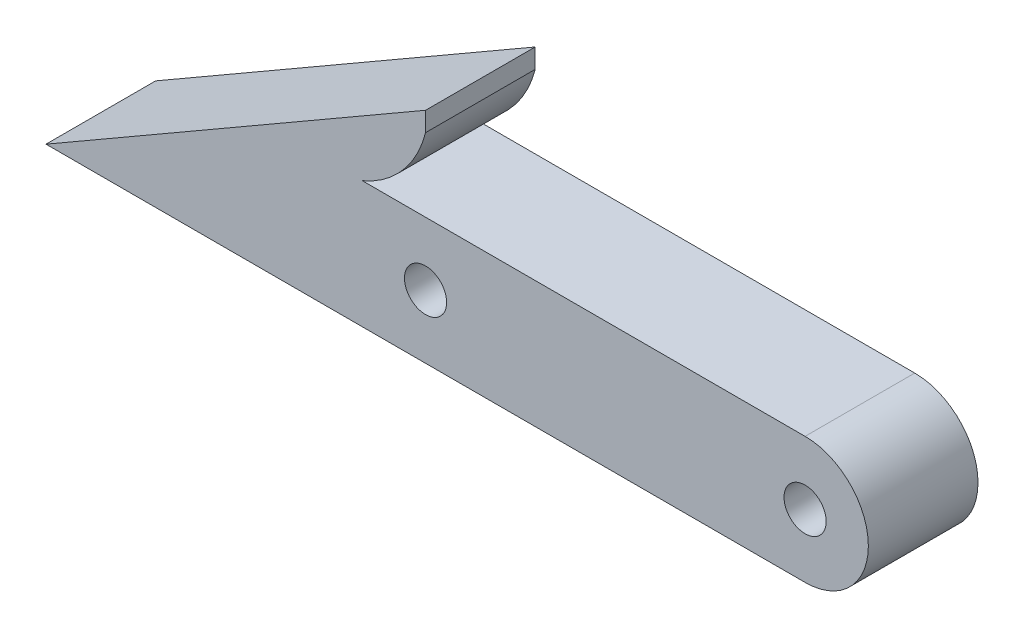
ISO-10303-21;
HEADER;
FILE_DESCRIPTION(('STEP AP214'),'2;1');
FILE_NAME('part.step','',(''),(''),'','','');
FILE_SCHEMA(('AUTOMOTIVE_DESIGN { 1 0 10303 214 1 1 1 1 }'));
ENDSEC;
DATA;
#1=APPLICATION_CONTEXT('core data for automotive mechanical design processes');
#2=APPLICATION_PROTOCOL_DEFINITION('international standard','automotive_design',2000,#1);
#3=PRODUCT_CONTEXT('',#1,'mechanical');
#4=PRODUCT('Part','Part','',(#3));
#5=PRODUCT_RELATED_PRODUCT_CATEGORY('part','',(#4));
#6=PRODUCT_DEFINITION_FORMATION('','',#4);
#7=PRODUCT_DEFINITION_CONTEXT('part definition',#1,'design');
#8=PRODUCT_DEFINITION('design','',#6,#7);
#9=PRODUCT_DEFINITION_SHAPE('','',#8);
#10=(LENGTH_UNIT() NAMED_UNIT(*) SI_UNIT(.MILLI.,.METRE.));
#11=(NAMED_UNIT(*) PLANE_ANGLE_UNIT() SI_UNIT($,.RADIAN.));
#12=(NAMED_UNIT(*) SI_UNIT($,.STERADIAN.) SOLID_ANGLE_UNIT());
#13=UNCERTAINTY_MEASURE_WITH_UNIT(LENGTH_MEASURE(1.E-05),#10,'distance_accuracy_value','');
#14=(GEOMETRIC_REPRESENTATION_CONTEXT(3) GLOBAL_UNCERTAINTY_ASSIGNED_CONTEXT((#13)) GLOBAL_UNIT_ASSIGNED_CONTEXT((#10,
#11,#12)) REPRESENTATION_CONTEXT('',''));
#15=CARTESIAN_POINT('',(0.,0.,0.));
#16=DIRECTION('',(0.,0.,1.));
#17=DIRECTION('',(1.,0.,0.));
#18=AXIS2_PLACEMENT_3D('',#15,#16,#17);
#19=CARTESIAN_POINT('',(0.,7.5,6.5));
#20=DIRECTION('',(0.,-1.,0.));
#21=DIRECTION('',(1.,0.,0.));
#22=AXIS2_PLACEMENT_3D('',#19,#20,#21);
#23=PLANE('',#22);
#24=DIRECTION('',(-1.,0.,0.));
#25=VECTOR('',#24,1.);
#26=CARTESIAN_POINT('',(0.,7.5,-6.5));
#27=LINE('',#26,#25);
#28=CARTESIAN_POINT('',(22.5,7.49999999999999,-6.5));
#29=VERTEX_POINT('',#28);
#30=CARTESIAN_POINT('',(-30.,7.5,-6.5));
#31=VERTEX_POINT('',#30);
#32=EDGE_CURVE('E138',#29,#31,#27,.T.);
#33=ORIENTED_EDGE('',*,*,#32,.T.);
#34=DIRECTION('',(0.,0.,-1.));
#35=VECTOR('',#34,1.);
#36=CARTESIAN_POINT('',(-30.,7.5,6.5));
#37=LINE('',#36,#35);
#38=CARTESIAN_POINT('',(-30.,7.5,6.5));
#39=VERTEX_POINT('',#38);
#40=EDGE_CURVE('E11',#39,#31,#37,.T.);
#41=ORIENTED_EDGE('',*,*,#40,.F.);
#42=DIRECTION('',(-1.,0.,0.));
#43=VECTOR('',#42,1.);
#44=CARTESIAN_POINT('',(0.,7.5,6.5));
#45=LINE('',#44,#43);
#46=CARTESIAN_POINT('',(22.5,7.49999999999999,6.5));
#47=VERTEX_POINT('',#46);
#48=EDGE_CURVE('E91',#47,#39,#45,.T.);
#49=ORIENTED_EDGE('',*,*,#48,.F.);
#50=DIRECTION('',(0.,0.,-1.));
#51=VECTOR('',#50,1.);
#52=CARTESIAN_POINT('',(22.5,7.49999999999999,6.5));
#53=LINE('',#52,#51);
#54=EDGE_CURVE('E126',#47,#29,#53,.T.);
#55=ORIENTED_EDGE('',*,*,#54,.T.);
#56=EDGE_LOOP('',(#33,#41,#49,#55));
#57=FACE_BOUND('',#56,.T.);
#58=ADVANCED_FACE('F43',(#57),#23,.F.);
#59=CARTESIAN_POINT('',(-34.9272257432807,19.3373257055721,6.5));
#60=DIRECTION('',(0.,0.,-1.));
#61=DIRECTION('',(-1.,0.,0.));
#62=AXIS2_PLACEMENT_3D('',#59,#60,#61);
#63=CYLINDRICAL_SURFACE('',#62,12.8218498425557);
#64=CARTESIAN_POINT('',(-34.9272257432807,19.3373257055721,-6.5));
#65=DIRECTION('',(0.,0.,1.));
#66=DIRECTION('',(1.,0.,0.));
#67=AXIS2_PLACEMENT_3D('',#64,#65,#66);
#68=CIRCLE('',#67,12.8218498425557);
#69=CARTESIAN_POINT('',(-22.5,16.1807621135328,-6.5));
#70=VERTEX_POINT('',#69);
#71=EDGE_CURVE('E142',#70,#31,#68,.F.);
#72=ORIENTED_EDGE('',*,*,#71,.F.);
#73=DIRECTION('',(0.,0.,-1.));
#74=VECTOR('',#73,1.);
#75=CARTESIAN_POINT('',(-22.5,16.1807621135328,6.5));
#76=LINE('',#75,#74);
#77=CARTESIAN_POINT('',(-22.5,16.1807621135328,6.5));
#78=VERTEX_POINT('',#77);
#79=EDGE_CURVE('E53',#78,#70,#76,.T.);
#80=ORIENTED_EDGE('',*,*,#79,.F.);
#81=CARTESIAN_POINT('',(-34.9272257432807,19.3373257055721,6.5));
#82=DIRECTION('',(0.,0.,1.));
#83=DIRECTION('',(1.,0.,0.));
#84=AXIS2_PLACEMENT_3D('',#81,#82,#83);
#85=CIRCLE('',#84,12.8218498425557);
#86=EDGE_CURVE('E174',#78,#39,#85,.F.);
#87=ORIENTED_EDGE('',*,*,#86,.T.);
#88=ORIENTED_EDGE('',*,*,#40,.T.);
#89=EDGE_LOOP('',(#72,#80,#87,#88));
#90=FACE_BOUND('',#89,.T.);
#91=ADVANCED_FACE('F173',(#90),#63,.T.);
#92=CARTESIAN_POINT('',(-22.5,0.,6.5));
#93=DIRECTION('',(-1.,0.,0.));
#94=DIRECTION('',(0.,-1.,0.));
#95=AXIS2_PLACEMENT_3D('',#92,#93,#94);
#96=PLANE('',#95);
#97=DIRECTION('',(0.,1.,0.));
#98=VECTOR('',#97,1.);
#99=CARTESIAN_POINT('',(-22.5,0.,-6.5));
#100=LINE('',#99,#98);
#101=CARTESIAN_POINT('',(-22.5,18.4807621135328,-6.5));
#102=VERTEX_POINT('',#101);
#103=EDGE_CURVE('E146',#70,#102,#100,.T.);
#104=ORIENTED_EDGE('',*,*,#103,.T.);
#105=DIRECTION('',(0.,0.,-1.));
#106=VECTOR('',#105,1.);
#107=CARTESIAN_POINT('',(-22.5,18.4807621135328,6.5));
#108=LINE('',#107,#106);
#109=CARTESIAN_POINT('',(-22.5,18.4807621135328,6.5));
#110=VERTEX_POINT('',#109);
#111=EDGE_CURVE('E113',#110,#102,#108,.T.);
#112=ORIENTED_EDGE('',*,*,#111,.F.);
#113=DIRECTION('',(0.,1.,0.));
#114=VECTOR('',#113,1.);
#115=CARTESIAN_POINT('',(-22.5,0.,6.5));
#116=LINE('',#115,#114);
#117=EDGE_CURVE('E118',#78,#110,#116,.T.);
#118=ORIENTED_EDGE('',*,*,#117,.F.);
#119=ORIENTED_EDGE('',*,*,#79,.T.);
#120=EDGE_LOOP('',(#104,#112,#118,#119));
#121=FACE_BOUND('',#120,.T.);
#122=ADVANCED_FACE('F166',(#121),#96,.F.);
#123=CARTESIAN_POINT('',(-13.627404735808,23.6033573777246,6.5));
#124=DIRECTION('',(-0.499999999999995,0.866025403784442,0.));
#125=DIRECTION('',(-0.866025403784442,-0.499999999999995,0.));
#126=AXIS2_PLACEMENT_3D('',#123,#124,#125);
#127=PLANE('',#126);
#128=DIRECTION('',(0.866025403784442,0.499999999999995,0.));
#129=VECTOR('',#128,1.);
#130=CARTESIAN_POINT('',(-13.627404735808,23.6033573777246,-6.5));
#131=LINE('',#130,#129);
#132=CARTESIAN_POINT('',(-67.5,-7.5,-6.5));
#133=VERTEX_POINT('',#132);
#134=EDGE_CURVE('E107',#133,#102,#131,.T.);
#135=ORIENTED_EDGE('',*,*,#134,.F.);
#136=DIRECTION('',(0.,0.,-1.));
#137=VECTOR('',#136,1.);
#138=CARTESIAN_POINT('',(-67.5,-7.5,6.5));
#139=LINE('',#138,#137);
#140=CARTESIAN_POINT('',(-67.5,-7.5,6.5));
#141=VERTEX_POINT('',#140);
#142=EDGE_CURVE('E102',#141,#133,#139,.T.);
#143=ORIENTED_EDGE('',*,*,#142,.F.);
#144=DIRECTION('',(0.866025403784442,0.499999999999995,0.));
#145=VECTOR('',#144,1.);
#146=CARTESIAN_POINT('',(-13.627404735808,23.6033573777246,6.5));
#147=LINE('',#146,#145);
#148=EDGE_CURVE('E105',#141,#110,#147,.T.);
#149=ORIENTED_EDGE('',*,*,#148,.T.);
#150=ORIENTED_EDGE('',*,*,#111,.T.);
#151=EDGE_LOOP('',(#135,#143,#149,#150));
#152=FACE_BOUND('',#151,.T.);
#153=ADVANCED_FACE('F104',(#152),#127,.T.);
#154=CARTESIAN_POINT('',(0.,-7.49999999999999,6.5));
#155=DIRECTION('',(0.,-1.,0.));
#156=DIRECTION('',(1.,0.,0.));
#157=AXIS2_PLACEMENT_3D('',#154,#155,#156);
#158=PLANE('',#157);
#159=DIRECTION('',(-1.,0.,0.));
#160=VECTOR('',#159,1.);
#161=CARTESIAN_POINT('',(0.,-7.49999999999999,-6.5));
#162=LINE('',#161,#160);
#163=CARTESIAN_POINT('',(22.5,-7.49999999999999,-6.5));
#164=VERTEX_POINT('',#163);
#165=EDGE_CURVE('E152',#164,#133,#162,.T.);
#166=ORIENTED_EDGE('',*,*,#165,.F.);
#167=DIRECTION('',(0.,0.,-1.));
#168=VECTOR('',#167,1.);
#169=CARTESIAN_POINT('',(22.5,-7.49999999999999,6.5));
#170=LINE('',#169,#168);
#171=CARTESIAN_POINT('',(22.5,-7.49999999999999,6.5));
#172=VERTEX_POINT('',#171);
#173=EDGE_CURVE('E82',#172,#164,#170,.T.);
#174=ORIENTED_EDGE('',*,*,#173,.F.);
#175=DIRECTION('',(-1.,0.,0.));
#176=VECTOR('',#175,1.);
#177=CARTESIAN_POINT('',(0.,-7.49999999999999,6.5));
#178=LINE('',#177,#176);
#179=EDGE_CURVE('E116',#172,#141,#178,.T.);
#180=ORIENTED_EDGE('',*,*,#179,.T.);
#181=ORIENTED_EDGE('',*,*,#142,.T.);
#182=EDGE_LOOP('',(#166,#174,#180,#181));
#183=FACE_BOUND('',#182,.T.);
#184=ADVANCED_FACE('F122',(#183),#158,.T.);
#185=CARTESIAN_POINT('',(-22.5,0.,6.5));
#186=DIRECTION('',(0.,0.,-1.));
#187=DIRECTION('',(-1.,0.,0.));
#188=AXIS2_PLACEMENT_3D('',#185,#186,#187);
#189=CYLINDRICAL_SURFACE('',#188,2.5);
#190=CARTESIAN_POINT('',(-22.5,0.,6.5));
#191=DIRECTION('',(0.,0.,1.));
#192=DIRECTION('',(1.,0.,0.));
#193=AXIS2_PLACEMENT_3D('',#190,#191,#192);
#194=CIRCLE('',#193,2.5);
#195=CARTESIAN_POINT('',(-20.,0.,6.5));
#196=VERTEX_POINT('',#195);
#197=EDGE_CURVE('E204',#196,#196,#194,.T.);
#198=ORIENTED_EDGE('',*,*,#197,.T.);
#199=EDGE_LOOP('',(#198));
#200=FACE_BOUND('',#199,.T.);
#201=CARTESIAN_POINT('',(-22.5,0.,-6.5));
#202=DIRECTION('',(0.,0.,1.));
#203=DIRECTION('',(1.,0.,0.));
#204=AXIS2_PLACEMENT_3D('',#201,#202,#203);
#205=CIRCLE('',#204,2.5);
#206=CARTESIAN_POINT('',(-20.,0.,-6.5));
#207=VERTEX_POINT('',#206);
#208=EDGE_CURVE('E134',#207,#207,#205,.T.);
#209=ORIENTED_EDGE('',*,*,#208,.F.);
#210=EDGE_LOOP('',(#209));
#211=FACE_BOUND('',#210,.T.);
#212=ADVANCED_FACE('F185',(#200,#211),#189,.F.);
#213=CARTESIAN_POINT('',(22.5,0.,6.5));
#214=DIRECTION('',(0.,0.,-1.));
#215=DIRECTION('',(-1.,0.,0.));
#216=AXIS2_PLACEMENT_3D('',#213,#214,#215);
#217=CYLINDRICAL_SURFACE('',#216,2.5);
#218=CARTESIAN_POINT('',(22.5,0.,6.5));
#219=DIRECTION('',(0.,0.,1.));
#220=DIRECTION('',(1.,0.,0.));
#221=AXIS2_PLACEMENT_3D('',#218,#219,#220);
#222=CIRCLE('',#221,2.5);
#223=CARTESIAN_POINT('',(25.,0.,6.5));
#224=VERTEX_POINT('',#223);
#225=EDGE_CURVE('E157',#224,#224,#222,.T.);
#226=ORIENTED_EDGE('',*,*,#225,.T.);
#227=EDGE_LOOP('',(#226));
#228=FACE_BOUND('',#227,.T.);
#229=CARTESIAN_POINT('',(22.5,0.,-6.5));
#230=DIRECTION('',(0.,0.,1.));
#231=DIRECTION('',(1.,0.,0.));
#232=AXIS2_PLACEMENT_3D('',#229,#230,#231);
#233=CIRCLE('',#232,2.5);
#234=CARTESIAN_POINT('',(25.,0.,-6.5));
#235=VERTEX_POINT('',#234);
#236=EDGE_CURVE('E130',#235,#235,#233,.T.);
#237=ORIENTED_EDGE('',*,*,#236,.F.);
#238=EDGE_LOOP('',(#237));
#239=FACE_BOUND('',#238,.T.);
#240=ADVANCED_FACE('F45',(#228,#239),#217,.F.);
#241=CARTESIAN_POINT('',(22.5,0.,6.5));
#242=DIRECTION('',(0.,0.,-1.));
#243=DIRECTION('',(-1.,0.,0.));
#244=AXIS2_PLACEMENT_3D('',#241,#242,#243);
#245=CYLINDRICAL_SURFACE('',#244,7.49999999999999);
#246=CARTESIAN_POINT('',(22.5,0.,-6.5));
#247=DIRECTION('',(0.,0.,1.));
#248=DIRECTION('',(1.,0.,0.));
#249=AXIS2_PLACEMENT_3D('',#246,#247,#248);
#250=CIRCLE('',#249,7.49999999999999);
#251=EDGE_CURVE('E85',#164,#29,#250,.T.);
#252=ORIENTED_EDGE('',*,*,#251,.T.);
#253=ORIENTED_EDGE('',*,*,#54,.F.);
#254=CARTESIAN_POINT('',(22.5,0.,6.5));
#255=DIRECTION('',(0.,0.,1.));
#256=DIRECTION('',(1.,0.,0.));
#257=AXIS2_PLACEMENT_3D('',#254,#255,#256);
#258=CIRCLE('',#257,7.49999999999999);
#259=EDGE_CURVE('E61',#172,#47,#258,.T.);
#260=ORIENTED_EDGE('',*,*,#259,.F.);
#261=ORIENTED_EDGE('',*,*,#173,.T.);
#262=EDGE_LOOP('',(#252,#253,#260,#261));
#263=FACE_BOUND('',#262,.T.);
#264=ADVANCED_FACE('F176',(#263),#245,.T.);
#265=CARTESIAN_POINT('',(0.,0.,6.5));
#266=DIRECTION('',(0.,0.,1.));
#267=DIRECTION('',(1.,0.,0.));
#268=AXIS2_PLACEMENT_3D('',#265,#266,#267);
#269=PLANE('',#268);
#270=ORIENTED_EDGE('',*,*,#225,.F.);
#271=EDGE_LOOP('',(#270));
#272=FACE_BOUND('',#271,.T.);
#273=ORIENTED_EDGE('',*,*,#197,.F.);
#274=EDGE_LOOP('',(#273));
#275=FACE_BOUND('',#274,.T.);
#276=ORIENTED_EDGE('',*,*,#48,.T.);
#277=ORIENTED_EDGE('',*,*,#86,.F.);
#278=ORIENTED_EDGE('',*,*,#117,.T.);
#279=ORIENTED_EDGE('',*,*,#148,.F.);
#280=ORIENTED_EDGE('',*,*,#179,.F.);
#281=ORIENTED_EDGE('',*,*,#259,.T.);
#282=EDGE_LOOP('',(#276,#277,#278,#279,#280,#281));
#283=FACE_BOUND('',#282,.T.);
#284=ADVANCED_FACE('F115',(#272,#275,#283),#269,.T.);
#285=CARTESIAN_POINT('',(0.,0.,-6.5));
#286=DIRECTION('',(0.,0.,1.));
#287=DIRECTION('',(1.,0.,0.));
#288=AXIS2_PLACEMENT_3D('',#285,#286,#287);
#289=PLANE('',#288);
#290=ORIENTED_EDGE('',*,*,#236,.T.);
#291=EDGE_LOOP('',(#290));
#292=FACE_BOUND('',#291,.T.);
#293=ORIENTED_EDGE('',*,*,#208,.T.);
#294=EDGE_LOOP('',(#293));
#295=FACE_BOUND('',#294,.T.);
#296=ORIENTED_EDGE('',*,*,#32,.F.);
#297=ORIENTED_EDGE('',*,*,#251,.F.);
#298=ORIENTED_EDGE('',*,*,#165,.T.);
#299=ORIENTED_EDGE('',*,*,#134,.T.);
#300=ORIENTED_EDGE('',*,*,#103,.F.);
#301=ORIENTED_EDGE('',*,*,#71,.T.);
#302=EDGE_LOOP('',(#296,#297,#298,#299,#300,#301));
#303=FACE_BOUND('',#302,.T.);
#304=ADVANCED_FACE('F172',(#292,#295,#303),#289,.F.);
#305=CLOSED_SHELL('',(#58,#91,#122,#153,#184,#212,#240,#264,#284,#304));
#306=MANIFOLD_SOLID_BREP('B2',#305);
#307=ADVANCED_BREP_SHAPE_REPRESENTATION('',(#18,#306),#14);
#308=SHAPE_DEFINITION_REPRESENTATION(#9,#307);
ENDSEC;
END-ISO-10303-21;
